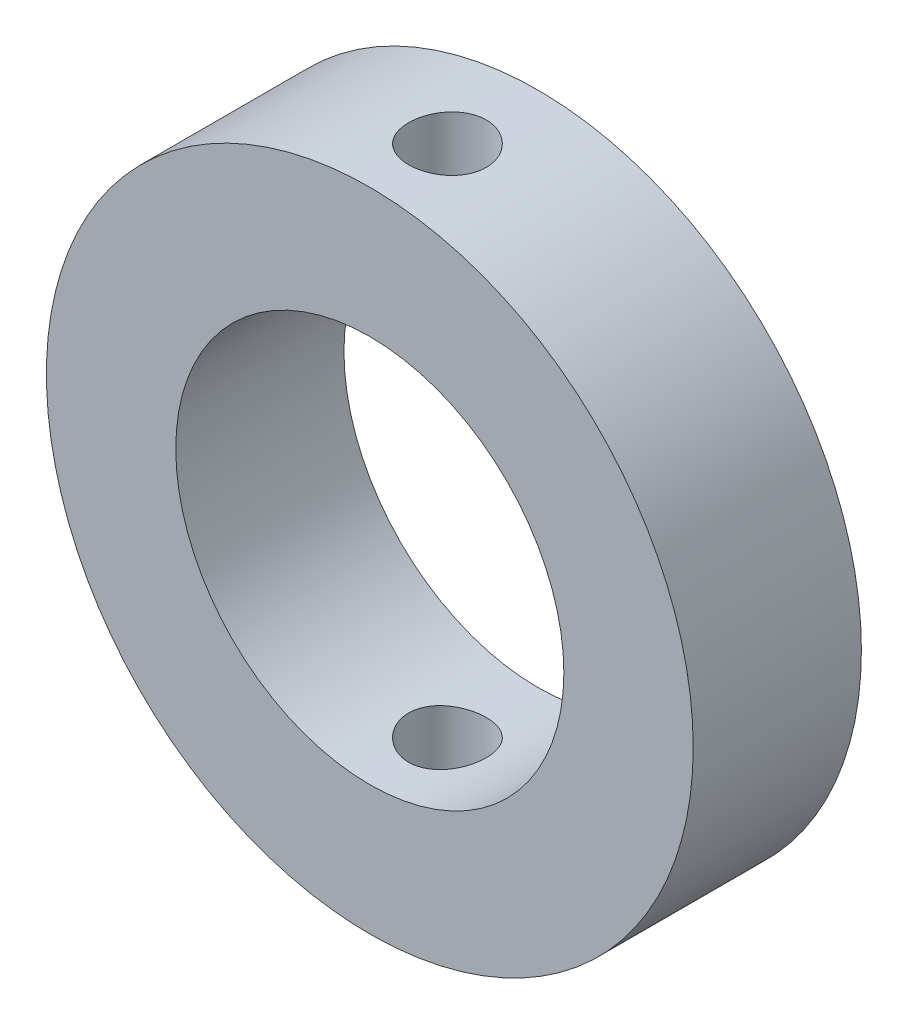
ISO-10303-21;
HEADER;
FILE_DESCRIPTION(('STEP AP214'),'2;1');
FILE_NAME('part.step','',(''),(''),'','','');
FILE_SCHEMA(('AUTOMOTIVE_DESIGN { 1 0 10303 214 1 1 1 1 }'));
ENDSEC;
DATA;
#1=APPLICATION_CONTEXT('core data for automotive mechanical design processes');
#2=APPLICATION_PROTOCOL_DEFINITION('international standard','automotive_design',2000,#1);
#3=PRODUCT_CONTEXT('',#1,'mechanical');
#4=PRODUCT('Part','Part','',(#3));
#5=PRODUCT_RELATED_PRODUCT_CATEGORY('part','',(#4));
#6=PRODUCT_DEFINITION_FORMATION('','',#4);
#7=PRODUCT_DEFINITION_CONTEXT('part definition',#1,'design');
#8=PRODUCT_DEFINITION('design','',#6,#7);
#9=PRODUCT_DEFINITION_SHAPE('','',#8);
#10=(LENGTH_UNIT() NAMED_UNIT(*) SI_UNIT(.MILLI.,.METRE.));
#11=(NAMED_UNIT(*) PLANE_ANGLE_UNIT() SI_UNIT($,.RADIAN.));
#12=(NAMED_UNIT(*) SI_UNIT($,.STERADIAN.) SOLID_ANGLE_UNIT());
#13=UNCERTAINTY_MEASURE_WITH_UNIT(LENGTH_MEASURE(1.E-05),#10,'distance_accuracy_value','');
#14=(GEOMETRIC_REPRESENTATION_CONTEXT(3) GLOBAL_UNCERTAINTY_ASSIGNED_CONTEXT((#13)) GLOBAL_UNIT_ASSIGNED_CONTEXT((#10,
#11,#12)) REPRESENTATION_CONTEXT('',''));
#15=CARTESIAN_POINT('',(0.,0.,0.));
#16=DIRECTION('',(0.,0.,1.));
#17=DIRECTION('',(1.,0.,0.));
#18=AXIS2_PLACEMENT_3D('',#15,#16,#17);
#19=CARTESIAN_POINT('',(0.,0.,13.));
#20=DIRECTION('',(0.,0.,1.));
#21=DIRECTION('',(1.,0.,0.));
#22=AXIS2_PLACEMENT_3D('',#19,#20,#21);
#23=PLANE('',#22);
#24=CARTESIAN_POINT('',(0.,0.,13.));
#25=DIRECTION('',(0.,0.,1.));
#26=DIRECTION('',(1.,0.,0.));
#27=AXIS2_PLACEMENT_3D('',#24,#25,#26);
#28=CIRCLE('',#27,25.);
#29=CARTESIAN_POINT('',(25.,0.,13.));
#30=VERTEX_POINT('',#29);
#31=EDGE_CURVE('E10',#30,#30,#28,.T.);
#32=ORIENTED_EDGE('',*,*,#31,.T.);
#33=EDGE_LOOP('',(#32));
#34=FACE_BOUND('',#33,.T.);
#35=CARTESIAN_POINT('',(0.,0.,13.));
#36=DIRECTION('',(0.,0.,1.));
#37=DIRECTION('',(1.,0.,0.));
#38=AXIS2_PLACEMENT_3D('',#35,#36,#37);
#39=CIRCLE('',#38,15.);
#40=CARTESIAN_POINT('',(15.,0.,13.));
#41=VERTEX_POINT('',#40);
#42=EDGE_CURVE('E58',#41,#41,#39,.T.);
#43=ORIENTED_EDGE('',*,*,#42,.F.);
#44=EDGE_LOOP('',(#43));
#45=FACE_BOUND('',#44,.T.);
#46=ADVANCED_FACE('F37',(#34,#45),#23,.T.);
#47=CARTESIAN_POINT('',(0.,0.,0.));
#48=DIRECTION('',(0.,0.,1.));
#49=DIRECTION('',(1.,0.,0.));
#50=AXIS2_PLACEMENT_3D('',#47,#48,#49);
#51=PLANE('',#50);
#52=CARTESIAN_POINT('',(0.,0.,0.));
#53=DIRECTION('',(0.,0.,1.));
#54=DIRECTION('',(1.,0.,0.));
#55=AXIS2_PLACEMENT_3D('',#52,#53,#54);
#56=CIRCLE('',#55,25.);
#57=CARTESIAN_POINT('',(25.,0.,0.));
#58=VERTEX_POINT('',#57);
#59=EDGE_CURVE('E52',#58,#58,#56,.T.);
#60=ORIENTED_EDGE('',*,*,#59,.F.);
#61=EDGE_LOOP('',(#60));
#62=FACE_BOUND('',#61,.T.);
#63=CARTESIAN_POINT('',(0.,0.,0.));
#64=DIRECTION('',(0.,0.,1.));
#65=DIRECTION('',(1.,0.,0.));
#66=AXIS2_PLACEMENT_3D('',#63,#64,#65);
#67=CIRCLE('',#66,15.);
#68=CARTESIAN_POINT('',(15.,0.,0.));
#69=VERTEX_POINT('',#68);
#70=EDGE_CURVE('E61',#69,#69,#67,.T.);
#71=ORIENTED_EDGE('',*,*,#70,.T.);
#72=EDGE_LOOP('',(#71));
#73=FACE_BOUND('',#72,.T.);
#74=ADVANCED_FACE('F102',(#62,#73),#51,.F.);
#75=CARTESIAN_POINT('',(0.,0.,13.));
#76=DIRECTION('',(0.,0.,-1.));
#77=DIRECTION('',(-1.,0.,0.));
#78=AXIS2_PLACEMENT_3D('',#75,#76,#77);
#79=CYLINDRICAL_SURFACE('',#78,25.);
#80=CARTESIAN_POINT('',(0.,-25.,10.));
#81=CARTESIAN_POINT('',(0.167864047107699,-24.9999977357459,9.99999283605856));
#82=CARTESIAN_POINT('',(0.335834317331191,-24.9982914200408,9.98586334130731));
#83=CARTESIAN_POINT('',(0.667104571308249,-24.991648705422,9.92971893584461));
#84=CARTESIAN_POINT('',(0.830399429590069,-24.9867088933728,9.88767455874941));
#85=CARTESIAN_POINT('',(1.14747479534053,-24.9741559265426,9.77695372347398));
#86=CARTESIAN_POINT('',(1.30126148759225,-24.9665445315309,9.70829479317582));
#87=CARTESIAN_POINT('',(1.595099157832,-24.9494959264345,9.5463312649167));
#88=CARTESIAN_POINT('',(1.73515256713516,-24.9400590404141,9.45303104024668));
#89=CARTESIAN_POINT('',(1.99829131534451,-24.920360105442,9.24392513802476));
#90=CARTESIAN_POINT('',(2.1212966913072,-24.9100945030904,9.12801915988808));
#91=CARTESIAN_POINT('',(2.34615931038342,-24.8899239397152,8.8772070351121));
#92=CARTESIAN_POINT('',(2.44801549826474,-24.8800189967068,8.74229994098135));
#93=CARTESIAN_POINT('',(2.62798342873896,-24.8616560370405,8.45679917470161));
#94=CARTESIAN_POINT('',(2.7060207567257,-24.8532025903971,8.30615827541986));
#95=CARTESIAN_POINT('',(2.8356605730156,-24.8387461344686,7.99379129789125));
#96=CARTESIAN_POINT('',(2.88726398696776,-24.8327430393798,7.83206560803069));
#97=CARTESIAN_POINT('',(2.96232930045399,-24.8239006073737,7.50294714068857));
#98=CARTESIAN_POINT('',(2.98592577987646,-24.8210461452543,7.33558547157232));
#99=CARTESIAN_POINT('',(3.0047237521967,-24.8187777690611,6.99925506363583));
#100=CARTESIAN_POINT('',(2.99992630052848,-24.8193637271033,6.83028638478303));
#101=CARTESIAN_POINT('',(2.96218316078668,-24.8238961466306,6.49647403521565));
#102=CARTESIAN_POINT('',(2.92938543222303,-24.8278249434675,6.33161336131982));
#103=CARTESIAN_POINT('',(2.83680346170067,-24.8385728087608,6.00975297217864));
#104=CARTESIAN_POINT('',(2.77701871225814,-24.8453919315688,5.852753404821));
#105=CARTESIAN_POINT('',(2.63199980699862,-24.8611722079476,5.55061053176088));
#106=CARTESIAN_POINT('',(2.54670106203925,-24.8701387862198,5.40549852164644));
#107=CARTESIAN_POINT('',(2.35312173169469,-24.8891993987901,5.13159278908423));
#108=CARTESIAN_POINT('',(2.24484017723156,-24.8992934806213,5.00279975509742));
#109=CARTESIAN_POINT('',(2.0075475556218,-24.9195503308637,4.76432891563562));
#110=CARTESIAN_POINT('',(1.87840890051216,-24.929713127424,4.65477803014294));
#111=CARTESIAN_POINT('',(1.60350795893872,-24.9489020798549,4.45888847899969));
#112=CARTESIAN_POINT('',(1.45774563908004,-24.9579282334421,4.37254985998085));
#113=CARTESIAN_POINT('',(1.15363930826284,-24.9738318861702,4.22553671436034));
#114=CARTESIAN_POINT('',(0.99529157871559,-24.9807087472809,4.16486980666956));
#115=CARTESIAN_POINT('',(0.670556022273439,-24.991533065309,4.0710212621491));
#116=CARTESIAN_POINT('',(0.504168542441622,-24.9954806485584,4.03783843999552));
#117=CARTESIAN_POINT('',(0.169174396374216,-24.9999852500304,4.00006374450231));
#118=CARTESIAN_POINT('',(0.00058772043205139,-25.0005630093753,3.9952969675993));
#119=CARTESIAN_POINT('',(-0.33498206824326,-24.9983187823231,4.01402857786827));
#120=CARTESIAN_POINT('',(-0.501965212327329,-24.9954968625308,4.03752641129535));
#121=CARTESIAN_POINT('',(-0.829074263928357,-24.9867833380686,4.11197496400309));
#122=CARTESIAN_POINT('',(-0.989219346369035,-24.9809010237909,4.16284261305008));
#123=CARTESIAN_POINT('',(-1.29870539768646,-24.9667255501792,4.29050070335358));
#124=CARTESIAN_POINT('',(-1.44804602592347,-24.9584323148759,4.36729196149008));
#125=CARTESIAN_POINT('',(-1.73246717766504,-24.9403085158695,4.54504291590243));
#126=CARTESIAN_POINT('',(-1.86747628962751,-24.9304708084643,4.64611613781082));
#127=CARTESIAN_POINT('',(-2.11867625152203,-24.9103817919419,4.86940084640817));
#128=CARTESIAN_POINT('',(-2.23486641472949,-24.9001304677484,4.99161310414795));
#129=CARTESIAN_POINT('',(-2.44574795226154,-24.8803059484942,5.25447561542769));
#130=CARTESIAN_POINT('',(-2.54032363231939,-24.8707365831307,5.39521901534385));
#131=CARTESIAN_POINT('',(-2.70449314429332,-24.8534214993383,5.69069502507556));
#132=CARTESIAN_POINT('',(-2.77408744356074,-24.8456757467943,5.84542737311824));
#133=CARTESIAN_POINT('',(-2.88612996668159,-24.8329105734502,6.16411060889469));
#134=CARTESIAN_POINT('',(-2.92864420159346,-24.8278845275633,6.32803801185939));
#135=CARTESIAN_POINT('',(-2.98553272163516,-24.8211085274587,6.66076896948507));
#136=CARTESIAN_POINT('',(-2.99990820526081,-24.8193584337106,6.82957231615732));
#137=CARTESIAN_POINT('',(-3.00009033817931,-24.819336326607,7.16611272963717));
#138=CARTESIAN_POINT('',(-2.98607873671351,-24.8210421863943,7.33384972577127));
#139=CARTESIAN_POINT('',(-2.93026848672089,-24.8276922947425,7.66456678639417));
#140=CARTESIAN_POINT('',(-2.88846982822067,-24.8326365444656,7.82754684917558));
#141=CARTESIAN_POINT('',(-2.77832739820545,-24.8451996524586,8.1441045388887));
#142=CARTESIAN_POINT('',(-2.70999165570539,-24.8528177016812,8.29768499349548));
#143=CARTESIAN_POINT('',(-2.54873282628009,-24.8698714539139,8.5912277470701));
#144=CARTESIAN_POINT('',(-2.45580952709445,-24.8793071726153,8.7311899284593));
#145=CARTESIAN_POINT('',(-2.24733689647205,-24.8990055122588,8.99445294010884));
#146=CARTESIAN_POINT('',(-2.1316520393015,-24.9092728581347,9.11764610326628));
#147=CARTESIAN_POINT('',(-1.88122093334447,-24.9294354968169,9.342942479566));
#148=CARTESIAN_POINT('',(-1.74647018263601,-24.939330701051,9.44504069762919));
#149=CARTESIAN_POINT('',(-1.46119322465137,-24.9576721709324,9.62555057799885));
#150=CARTESIAN_POINT('',(-1.31061323462417,-24.966113221621,9.70387772572228));
#151=CARTESIAN_POINT('',(-0.998422751685311,-24.9805418519727,9.83402376444257));
#152=CARTESIAN_POINT('',(-0.836824564362144,-24.9865321180615,9.88587169618039));
#153=CARTESIAN_POINT('',(-0.561977101236695,-24.9939268325999,9.94906342033812));
#154=CARTESIAN_POINT('',(-0.450466569753485,-24.996193279433,9.96813748388637));
#155=CARTESIAN_POINT('',(-0.225986735693693,-24.9992306204204,9.99360814349096));
#156=CARTESIAN_POINT('',(-0.113017442753625,-25.0000015244492,10.0000048232504));
#157=CARTESIAN_POINT('',(0.,-25.,10.));
#158=B_SPLINE_CURVE_WITH_KNOTS('',3,(#80,#81,#82,#83,#84,#85,#86,#87,#88,#89,#90,#91,#92,#93,
#94,#95,#96,#97,#98,#99,#100,#101,#102,#103,#104,#105,#106,#107,#108,#109,#110,#111,#112,#113,
#114,#115,#116,#117,#118,#119,#120,#121,#122,#123,#124,#125,#126,#127,#128,#129,#130,#131,#132,
#133,#134,#135,#136,#137,#138,#139,#140,#141,#142,#143,#144,#145,#146,#147,#148,#149,#150,#151,
#152,#153,#154,#155,#156,#157),.UNSPECIFIED.,.T.,.F.,(4,2,2,2,2,2,2,2,2,2,2,2,2,2,2,2,2,2,2,2,2,
2,2,2,2,2,2,2,2,2,2,2,2,2,2,2,2,2,4),(0.,0.503179350956159,1.00689069408623,1.5102708637556,
2.01356175441693,2.51913872195878,3.02474090904883,3.53190689496397,4.03905511999114,
4.54375638343279,5.0484388866848,5.55047092912253,6.05251241253396,6.55583573710536,
7.05918028869262,7.56572944640317,8.07227962172601,8.57898002694278,9.08565857822619,
9.58921522624226,10.0927620090108,10.5947890255775,11.0968318630167,11.6012692178556,
12.1057249760357,12.6128207581672,13.119907053063,13.6257524826489,14.1315763666154,
14.6341719319229,15.1367676776234,15.6392114771388,16.1416596143122,16.6471952402032,
17.1528504352009,17.6602829023946,18.1671576479275,18.5059342945627,18.8447087043981),.UNSPECIFIED.);
#159=CARTESIAN_POINT('',(0.,-25.,10.));
#160=VERTEX_POINT('',#159);
#161=EDGE_CURVE('E88',#160,#160,#158,.T.);
#162=ORIENTED_EDGE('',*,*,#161,.T.);
#163=EDGE_LOOP('',(#162));
#164=FACE_BOUND('',#163,.T.);
#165=CARTESIAN_POINT('',(0.,25.,10.));
#166=CARTESIAN_POINT('',(-0.167864047107699,24.9999977357459,9.99999283605856));
#167=CARTESIAN_POINT('',(-0.335834317331191,24.9982914200408,9.98586334130731));
#168=CARTESIAN_POINT('',(-0.66710457130825,24.991648705422,9.92971893584461));
#169=CARTESIAN_POINT('',(-0.830399429590069,24.9867088933728,9.88767455874941));
#170=CARTESIAN_POINT('',(-1.14747479534053,24.9741559265426,9.77695372347398));
#171=CARTESIAN_POINT('',(-1.30126148759225,24.9665445315309,9.70829479317582));
#172=CARTESIAN_POINT('',(-1.595099157832,24.9494959264345,9.5463312649167));
#173=CARTESIAN_POINT('',(-1.73515256713516,24.9400590404141,9.45303104024668));
#174=CARTESIAN_POINT('',(-1.99829131534451,24.920360105442,9.24392513802476));
#175=CARTESIAN_POINT('',(-2.1212966913072,24.9100945030904,9.12801915988808));
#176=CARTESIAN_POINT('',(-2.34615931038342,24.8899239397152,8.8772070351121));
#177=CARTESIAN_POINT('',(-2.44801549826474,24.8800189967068,8.74229994098135));
#178=CARTESIAN_POINT('',(-2.62798342873896,24.8616560370405,8.45679917470161));
#179=CARTESIAN_POINT('',(-2.7060207567257,24.8532025903971,8.30615827541986));
#180=CARTESIAN_POINT('',(-2.8356605730156,24.8387461344686,7.99379129789125));
#181=CARTESIAN_POINT('',(-2.88726398696776,24.8327430393798,7.83206560803069));
#182=CARTESIAN_POINT('',(-2.96232930045399,24.8239006073737,7.50294714068857));
#183=CARTESIAN_POINT('',(-2.98592577987646,24.8210461452543,7.33558547157232));
#184=CARTESIAN_POINT('',(-3.0047237521967,24.8187777690611,6.99925506363583));
#185=CARTESIAN_POINT('',(-2.99992630052848,24.8193637271033,6.83028638478303));
#186=CARTESIAN_POINT('',(-2.96218316078668,24.8238961466306,6.49647403521565));
#187=CARTESIAN_POINT('',(-2.92938543222303,24.8278249434675,6.33161336131982));
#188=CARTESIAN_POINT('',(-2.83680346170067,24.8385728087608,6.00975297217864));
#189=CARTESIAN_POINT('',(-2.77701871225814,24.8453919315688,5.852753404821));
#190=CARTESIAN_POINT('',(-2.63199980699862,24.8611722079476,5.55061053176088));
#191=CARTESIAN_POINT('',(-2.54670106203925,24.8701387862198,5.40549852164644));
#192=CARTESIAN_POINT('',(-2.35312173169469,24.8891993987901,5.13159278908423));
#193=CARTESIAN_POINT('',(-2.24484017723157,24.8992934806213,5.00279975509742));
#194=CARTESIAN_POINT('',(-2.0075475556218,24.9195503308637,4.76432891563562));
#195=CARTESIAN_POINT('',(-1.87840890051216,24.929713127424,4.65477803014294));
#196=CARTESIAN_POINT('',(-1.60350795893872,24.9489020798549,4.45888847899969));
#197=CARTESIAN_POINT('',(-1.45774563908005,24.9579282334421,4.37254985998085));
#198=CARTESIAN_POINT('',(-1.15363930826285,24.9738318861702,4.22553671436034));
#199=CARTESIAN_POINT('',(-0.995291578715592,24.9807087472809,4.16486980666956));
#200=CARTESIAN_POINT('',(-0.67055602227344,24.991533065309,4.0710212621491));
#201=CARTESIAN_POINT('',(-0.504168542441624,24.9954806485584,4.03783843999552));
#202=CARTESIAN_POINT('',(-0.169174396374217,24.9999852500304,4.00006374450231));
#203=CARTESIAN_POINT('',(-0.000587720432052122,25.0005630093753,3.9952969675993));
#204=CARTESIAN_POINT('',(0.33498206824326,24.9983187823231,4.01402857786827));
#205=CARTESIAN_POINT('',(0.501965212327329,24.9954968625308,4.03752641129535));
#206=CARTESIAN_POINT('',(0.829074263928357,24.9867833380686,4.11197496400309));
#207=CARTESIAN_POINT('',(0.989219346369036,24.9809010237909,4.16284261305008));
#208=CARTESIAN_POINT('',(1.29870539768646,24.9667255501792,4.29050070335358));
#209=CARTESIAN_POINT('',(1.44804602592347,24.9584323148759,4.36729196149009));
#210=CARTESIAN_POINT('',(1.73246717766505,24.9403085158695,4.54504291590243));
#211=CARTESIAN_POINT('',(1.86747628962751,24.9304708084643,4.64611613781082));
#212=CARTESIAN_POINT('',(2.11867625152204,24.9103817919419,4.86940084640817));
#213=CARTESIAN_POINT('',(2.23486641472949,24.9001304677484,4.99161310414795));
#214=CARTESIAN_POINT('',(2.44574795226154,24.8803059484942,5.25447561542769));
#215=CARTESIAN_POINT('',(2.54032363231939,24.8707365831307,5.39521901534385));
#216=CARTESIAN_POINT('',(2.70449314429332,24.8534214993383,5.69069502507556));
#217=CARTESIAN_POINT('',(2.77408744356074,24.8456757467943,5.84542737311824));
#218=CARTESIAN_POINT('',(2.88612996668159,24.8329105734502,6.16411060889469));
#219=CARTESIAN_POINT('',(2.92864420159346,24.8278845275633,6.32803801185939));
#220=CARTESIAN_POINT('',(2.98553272163516,24.8211085274587,6.66076896948507));
#221=CARTESIAN_POINT('',(2.99990820526081,24.8193584337106,6.82957231615732));
#222=CARTESIAN_POINT('',(3.00009033817931,24.819336326607,7.16611272963717));
#223=CARTESIAN_POINT('',(2.98607873671351,24.8210421863943,7.33384972577126));
#224=CARTESIAN_POINT('',(2.93026848672089,24.8276922947425,7.66456678639417));
#225=CARTESIAN_POINT('',(2.88846982822067,24.8326365444656,7.82754684917558));
#226=CARTESIAN_POINT('',(2.77832739820545,24.8451996524586,8.14410453888869));
#227=CARTESIAN_POINT('',(2.70999165570539,24.8528177016812,8.29768499349548));
#228=CARTESIAN_POINT('',(2.5487328262801,24.8698714539139,8.5912277470701));
#229=CARTESIAN_POINT('',(2.45580952709445,24.8793071726153,8.7311899284593));
#230=CARTESIAN_POINT('',(2.24733689647205,24.8990055122588,8.99445294010883));
#231=CARTESIAN_POINT('',(2.1316520393015,24.9092728581347,9.11764610326627));
#232=CARTESIAN_POINT('',(1.88122093334448,24.9294354968169,9.342942479566));
#233=CARTESIAN_POINT('',(1.74647018263601,24.939330701051,9.44504069762919));
#234=CARTESIAN_POINT('',(1.46119322465137,24.9576721709324,9.62555057799885));
#235=CARTESIAN_POINT('',(1.31061323462418,24.966113221621,9.70387772572228));
#236=CARTESIAN_POINT('',(0.998422751685312,24.9805418519727,9.83402376444257));
#237=CARTESIAN_POINT('',(0.836824564362145,24.9865321180615,9.88587169618038));
#238=CARTESIAN_POINT('',(0.561977101236698,24.9939268325999,9.94906342033812));
#239=CARTESIAN_POINT('',(0.450466569753488,24.996193279433,9.96813748388637));
#240=CARTESIAN_POINT('',(0.225986735693695,24.9992306204204,9.99360814349096));
#241=CARTESIAN_POINT('',(0.113017442753626,25.0000015244492,10.0000048232504));
#242=CARTESIAN_POINT('',(0.,25.,10.));
#243=B_SPLINE_CURVE_WITH_KNOTS('',3,(#165,#166,#167,#168,#169,#170,#171,#172,#173,#174,#175,
#176,#177,#178,#179,#180,#181,#182,#183,#184,#185,#186,#187,#188,#189,#190,#191,#192,#193,#194,
#195,#196,#197,#198,#199,#200,#201,#202,#203,#204,#205,#206,#207,#208,#209,#210,#211,#212,#213,
#214,#215,#216,#217,#218,#219,#220,#221,#222,#223,#224,#225,#226,#227,#228,#229,#230,#231,#232,
#233,#234,#235,#236,#237,#238,#239,#240,#241,#242),.UNSPECIFIED.,.T.,.F.,(4,2,2,2,2,2,2,2,2,2,2,
2,2,2,2,2,2,2,2,2,2,2,2,2,2,2,2,2,2,2,2,2,2,2,2,2,2,2,4),(0.,0.503179350956159,1.00689069408623,
1.5102708637556,2.01356175441693,2.51913872195878,3.02474090904884,3.53190689496398,
4.03905511999114,4.54375638343279,5.0484388866848,5.55047092912253,6.05251241253396,
6.55583573710536,7.05918028869262,7.56572944640317,8.07227962172601,8.57898002694278,
9.08565857822619,9.58921522624226,10.0927620090108,10.5947890255775,11.0968318630167,
11.6012692178556,12.1057249760357,12.6128207581672,13.119907053063,13.6257524826489,
14.1315763666154,14.6341719319229,15.1367676776234,15.6392114771388,16.1416596143121,
16.6471952402032,17.1528504352009,17.6602829023946,18.1671576479275,18.5059342945627,
18.8447087043981),.UNSPECIFIED.);
#244=CARTESIAN_POINT('',(0.,25.,10.));
#245=VERTEX_POINT('',#244);
#246=EDGE_CURVE('E82',#245,#245,#243,.T.);
#247=ORIENTED_EDGE('',*,*,#246,.T.);
#248=EDGE_LOOP('',(#247));
#249=FACE_BOUND('',#248,.T.);
#250=ORIENTED_EDGE('',*,*,#31,.F.);
#251=EDGE_LOOP('',(#250));
#252=FACE_BOUND('',#251,.T.);
#253=ORIENTED_EDGE('',*,*,#59,.T.);
#254=EDGE_LOOP('',(#253));
#255=FACE_BOUND('',#254,.T.);
#256=ADVANCED_FACE('F39',(#164,#249,#252,#255),#79,.T.);
#257=CARTESIAN_POINT('',(0.,0.,13.));
#258=DIRECTION('',(0.,0.,-1.));
#259=DIRECTION('',(-1.,0.,0.));
#260=AXIS2_PLACEMENT_3D('',#257,#258,#259);
#261=CYLINDRICAL_SURFACE('',#260,15.);
#262=CARTESIAN_POINT('',(0.,-15.,10.));
#263=CARTESIAN_POINT('',(0.1667307203779,-14.9999969274261,9.99999386650496));
#264=CARTESIAN_POINT('',(0.333538980604567,-14.9971915553469,9.98605347109706));
#265=CARTESIAN_POINT('',(0.662440523067058,-14.9862709686969,9.93070449965426));
#266=CARTESIAN_POINT('',(0.824529952624067,-14.9781515358056,9.88927410159547));
#267=CARTESIAN_POINT('',(1.13919091578994,-14.9575094783486,9.78027617913763));
#268=CARTESIAN_POINT('',(1.2917714037994,-14.9449910723015,9.71273368946593));
#269=CARTESIAN_POINT('',(1.58342396659268,-14.9169119410594,9.55350325746611));
#270=CARTESIAN_POINT('',(1.72249684522744,-14.9013513970712,9.46181675317838));
#271=CARTESIAN_POINT('',(1.9850804319446,-14.8686649598991,9.25558451712569));
#272=CARTESIAN_POINT('',(2.10838185347557,-14.8515223651304,9.14077493382639));
#273=CARTESIAN_POINT('',(2.33411026982408,-14.8177254135776,8.89212275082489));
#274=CARTESIAN_POINT('',(2.43653563431127,-14.8010710950127,8.75827866599464));
#275=CARTESIAN_POINT('',(2.61849526004286,-14.7699732543785,8.47385142096437));
#276=CARTESIAN_POINT('',(2.6978128165976,-14.7555512209484,8.32312706861092));
#277=CARTESIAN_POINT('',(2.82991699974092,-14.7307880417525,8.01015454298776));
#278=CARTESIAN_POINT('',(2.88270624731171,-14.7204464928588,7.84790750996096));
#279=CARTESIAN_POINT('',(2.95957589965448,-14.7051841575661,7.51874690827625));
#280=CARTESIAN_POINT('',(2.98402349387633,-14.7001941032156,7.35192236757332));
#281=CARTESIAN_POINT('',(3.00465638317836,-14.6959912518188,7.01647053590697));
#282=CARTESIAN_POINT('',(3.0008445681405,-14.6967778640352,6.84784343103956));
#283=CARTESIAN_POINT('',(2.96536371930546,-14.7039765344455,6.51625963593699));
#284=CARTESIAN_POINT('',(2.93411562073172,-14.7103035857629,6.35325578311806));
#285=CARTESIAN_POINT('',(2.84531365386915,-14.7277363848,6.03485177001099));
#286=CARTESIAN_POINT('',(2.78775852930204,-14.7388423607334,5.87945197324297));
#287=CARTESIAN_POINT('',(2.64757435102416,-14.7646685550122,5.5794542148892));
#288=CARTESIAN_POINT('',(2.56477845369634,-14.7794126944111,5.43493636129248));
#289=CARTESIAN_POINT('',(2.37658072371804,-14.8108385631919,5.16168745008155));
#290=CARTESIAN_POINT('',(2.27117629307049,-14.827520515151,5.03295820944652));
#291=CARTESIAN_POINT('',(2.03849980368175,-14.8613106372439,4.79251179262919));
#292=CARTESIAN_POINT('',(1.91086848363733,-14.8784210763271,4.68114229642261));
#293=CARTESIAN_POINT('',(1.63855507218603,-14.9108654614323,4.48133846109632));
#294=CARTESIAN_POINT('',(1.49387276213817,-14.9261993846692,4.39290441611926));
#295=CARTESIAN_POINT('',(1.19117816063676,-14.9534007048266,4.24141747232207));
#296=CARTESIAN_POINT('',(1.0331454587559,-14.9652626654482,4.17840431906639));
#297=CARTESIAN_POINT('',(0.708446929345993,-14.9841422696357,4.0799185778843));
#298=CARTESIAN_POINT('',(0.541782150217347,-14.9911605000159,4.04444265377911));
#299=CARTESIAN_POINT('',(0.207538216881449,-14.999480156006,4.00253063861717));
#300=CARTESIAN_POINT('',(0.0400209849767262,-15.0008752395741,3.99561874137919));
#301=CARTESIAN_POINT('',(-0.293774802578144,-14.9980515579031,4.00974957682654));
#302=CARTESIAN_POINT('',(-0.460053427331381,-14.9938331082434,4.03079073805779));
#303=CARTESIAN_POINT('',(-0.785116979839624,-14.9803149602405,4.09983512063187));
#304=CARTESIAN_POINT('',(-0.943955845019711,-14.9710612921262,4.14759420549371));
#305=CARTESIAN_POINT('',(-1.251370882499,-14.948506561831,4.26845194796743));
#306=CARTESIAN_POINT('',(-1.39994628491262,-14.9352051964268,4.34155250403049));
#307=CARTESIAN_POINT('',(-1.68462352105865,-14.9057973459988,4.51204747195394));
#308=CARTESIAN_POINT('',(-1.82055038025656,-14.8896585131116,4.60972834311683));
#309=CARTESIAN_POINT('',(-2.07425405735762,-14.8564420448965,4.82622757362184));
#310=CARTESIAN_POINT('',(-2.19202892679229,-14.8393643090516,4.9450481991996));
#311=CARTESIAN_POINT('',(-2.40792177232253,-14.8058791067089,5.20262005567337));
#312=CARTESIAN_POINT('',(-2.50571310734597,-14.7894858069991,5.34164723266401));
#313=CARTESIAN_POINT('',(-2.67655626015362,-14.7595257538858,5.63443408407004));
#314=CARTESIAN_POINT('',(-2.74960906776871,-14.7459588874003,5.78819316872066));
#315=CARTESIAN_POINT('',(-2.86845552474588,-14.7233022175315,6.10530473844864));
#316=CARTESIAN_POINT('',(-2.91439049937315,-14.7141892461656,6.26860252363096));
#317=CARTESIAN_POINT('',(-2.97812595488159,-14.7014231037608,6.60080036047271));
#318=CARTESIAN_POINT('',(-2.99593010467534,-14.6977692207333,6.76969967862804));
#319=CARTESIAN_POINT('',(-3.0027627326024,-14.6963744889414,7.10502659363296));
#320=CARTESIAN_POINT('',(-2.99230736421269,-14.698527575679,7.27144344678103));
#321=CARTESIAN_POINT('',(-2.94405691230018,-14.7082672045384,7.60009494971508));
#322=CARTESIAN_POINT('',(-2.90626204838789,-14.7158537030151,7.76232963308442));
#323=CARTESIAN_POINT('',(-2.80463570549686,-14.7355579265748,8.07768313372164));
#324=CARTESIAN_POINT('',(-2.74086752015203,-14.7476646305649,8.23082308150725));
#325=CARTESIAN_POINT('',(-2.58916393380481,-14.7750514492251,8.52431116220332));
#326=CARTESIAN_POINT('',(-2.50122650632465,-14.7903318299668,8.66465822117541));
#327=CARTESIAN_POINT('',(-2.30191774435924,-14.8226688156968,8.93114671645094));
#328=CARTESIAN_POINT('',(-2.19017366170554,-14.839751187291,9.05700629580278));
#329=CARTESIAN_POINT('',(-1.94719310703942,-14.8735824561586,9.28835861658751));
#330=CARTESIAN_POINT('',(-1.81595216146,-14.8903312758955,9.39384667095181));
#331=CARTESIAN_POINT('',(-1.53605288726474,-14.9218149716391,9.58250393183934));
#332=CARTESIAN_POINT('',(-1.3872266532895,-14.9365269365774,9.66542800984008));
#333=CARTESIAN_POINT('',(-1.0774990828222,-14.96205375255,9.80495836778977));
#334=CARTESIAN_POINT('',(-0.916608782589376,-14.9728721141585,9.86158836859748));
#335=CARTESIAN_POINT('',(-0.629464466771336,-14.9872911778611,9.93595584413415));
#336=CARTESIAN_POINT('',(-0.504844992041352,-14.9920290947536,9.95992958112327));
#337=CARTESIAN_POINT('',(-0.2534985756302,-14.9983846241968,9.99195373707509));
#338=CARTESIAN_POINT('',(-0.126771701245857,-15.0000023361946,10.0000046635293));
#339=CARTESIAN_POINT('',(0.,-15.,10.));
#340=B_SPLINE_CURVE_WITH_KNOTS('',3,(#262,#263,#264,#265,#266,#267,#268,#269,#270,#271,#272,
#273,#274,#275,#276,#277,#278,#279,#280,#281,#282,#283,#284,#285,#286,#287,#288,#289,#290,#291,
#292,#293,#294,#295,#296,#297,#298,#299,#300,#301,#302,#303,#304,#305,#306,#307,#308,#309,#310,
#311,#312,#313,#314,#315,#316,#317,#318,#319,#320,#321,#322,#323,#324,#325,#326,#327,#328,#329,
#330,#331,#332,#333,#334,#335,#336,#337,#338,#339),.UNSPECIFIED.,.T.,.F.,(4,2,2,2,2,2,2,2,2,2,2,
2,2,2,2,2,2,2,2,2,2,2,2,2,2,2,2,2,2,2,2,2,2,2,2,2,2,2,4),(0.,0.499728391983775,
0.999853952073969,1.49950120575103,1.99911870669259,2.50479801033656,3.0105167902421,
3.52083585017768,4.03110448095592,4.53468555310762,5.03821512843675,5.53415181018835,
6.03011217761189,6.52942470610778,7.02879464249012,7.53714757474052,8.04550702619461,
8.55465824562072,9.06374777094108,9.56432207028796,10.064868229736,10.5609136185217,
11.0569961764807,11.5591519810008,12.0613616503779,12.5712188573768,13.081055661704,
13.5882114309817,14.0953010499124,14.593191677031,15.0910783047783,15.5877588375933,
16.084481027456,16.5896422871743,17.0949196359879,17.6054849002691,18.1155886655256,
18.4955632586968,18.8755257411299),.UNSPECIFIED.);
#341=CARTESIAN_POINT('',(0.,-15.,10.));
#342=VERTEX_POINT('',#341);
#343=EDGE_CURVE('E42',#342,#342,#340,.T.);
#344=ORIENTED_EDGE('',*,*,#343,.F.);
#345=EDGE_LOOP('',(#344));
#346=FACE_BOUND('',#345,.T.);
#347=CARTESIAN_POINT('',(0.,15.,10.));
#348=CARTESIAN_POINT('',(-0.166730720377899,14.9999969274261,9.99999386650496));
#349=CARTESIAN_POINT('',(-0.333538980604567,14.9971915553469,9.98605347109706));
#350=CARTESIAN_POINT('',(-0.662440523067058,14.9862709686969,9.93070449965426));
#351=CARTESIAN_POINT('',(-0.824529952624068,14.9781515358056,9.88927410159547));
#352=CARTESIAN_POINT('',(-1.13919091578994,14.9575094783486,9.78027617913763));
#353=CARTESIAN_POINT('',(-1.2917714037994,14.9449910723015,9.71273368946593));
#354=CARTESIAN_POINT('',(-1.58342396659268,14.9169119410594,9.55350325746611));
#355=CARTESIAN_POINT('',(-1.72249684522744,14.9013513970712,9.46181675317838));
#356=CARTESIAN_POINT('',(-1.9850804319446,14.8686649598991,9.25558451712569));
#357=CARTESIAN_POINT('',(-2.10838185347557,14.8515223651304,9.14077493382639));
#358=CARTESIAN_POINT('',(-2.33411026982409,14.8177254135776,8.89212275082489));
#359=CARTESIAN_POINT('',(-2.43653563431127,14.8010710950127,8.75827866599464));
#360=CARTESIAN_POINT('',(-2.61849526004286,14.7699732543785,8.47385142096437));
#361=CARTESIAN_POINT('',(-2.6978128165976,14.7555512209484,8.32312706861092));
#362=CARTESIAN_POINT('',(-2.82991699974092,14.7307880417525,8.01015454298776));
#363=CARTESIAN_POINT('',(-2.88270624731171,14.7204464928588,7.84790750996096));
#364=CARTESIAN_POINT('',(-2.95957589965448,14.7051841575661,7.51874690827624));
#365=CARTESIAN_POINT('',(-2.98402349387633,14.7001941032156,7.35192236757332));
#366=CARTESIAN_POINT('',(-3.00465638317836,14.6959912518188,7.01647053590697));
#367=CARTESIAN_POINT('',(-3.0008445681405,14.6967778640352,6.84784343103956));
#368=CARTESIAN_POINT('',(-2.96536371930546,14.7039765344455,6.51625963593699));
#369=CARTESIAN_POINT('',(-2.93411562073172,14.7103035857629,6.35325578311806));
#370=CARTESIAN_POINT('',(-2.84531365386915,14.7277363848,6.03485177001099));
#371=CARTESIAN_POINT('',(-2.78775852930204,14.7388423607334,5.87945197324297));
#372=CARTESIAN_POINT('',(-2.64757435102416,14.7646685550122,5.5794542148892));
#373=CARTESIAN_POINT('',(-2.56477845369634,14.7794126944111,5.43493636129248));
#374=CARTESIAN_POINT('',(-2.37658072371804,14.8108385631919,5.16168745008156));
#375=CARTESIAN_POINT('',(-2.27117629307049,14.827520515151,5.03295820944653));
#376=CARTESIAN_POINT('',(-2.03849980368175,14.8613106372439,4.79251179262919));
#377=CARTESIAN_POINT('',(-1.91086848363734,14.8784210763271,4.68114229642261));
#378=CARTESIAN_POINT('',(-1.63855507218603,14.9108654614323,4.48133846109633));
#379=CARTESIAN_POINT('',(-1.49387276213817,14.9261993846692,4.39290441611926));
#380=CARTESIAN_POINT('',(-1.19117816063676,14.9534007048266,4.24141747232207));
#381=CARTESIAN_POINT('',(-1.0331454587559,14.9652626654482,4.17840431906639));
#382=CARTESIAN_POINT('',(-0.708446929345997,14.9841422696357,4.0799185778843));
#383=CARTESIAN_POINT('',(-0.541782150217351,14.9911605000159,4.04444265377911));
#384=CARTESIAN_POINT('',(-0.207538216881453,14.999480156006,4.00253063861717));
#385=CARTESIAN_POINT('',(-0.0400209849767306,15.0008752395741,3.99561874137919));
#386=CARTESIAN_POINT('',(0.29377480257814,14.9980515579031,4.00974957682654));
#387=CARTESIAN_POINT('',(0.460053427331378,14.9938331082434,4.03079073805778));
#388=CARTESIAN_POINT('',(0.785116979839621,14.9803149602405,4.09983512063187));
#389=CARTESIAN_POINT('',(0.943955845019708,14.9710612921262,4.14759420549371));
#390=CARTESIAN_POINT('',(1.251370882499,14.948506561831,4.26845194796743));
#391=CARTESIAN_POINT('',(1.39994628491262,14.9352051964268,4.34155250403049));
#392=CARTESIAN_POINT('',(1.68462352105865,14.9057973459988,4.51204747195394));
#393=CARTESIAN_POINT('',(1.82055038025656,14.8896585131116,4.60972834311683));
#394=CARTESIAN_POINT('',(2.07425405735762,14.8564420448965,4.82622757362184));
#395=CARTESIAN_POINT('',(2.19202892679229,14.8393643090516,4.9450481991996));
#396=CARTESIAN_POINT('',(2.40792177232253,14.8058791067089,5.20262005567337));
#397=CARTESIAN_POINT('',(2.50571310734596,14.7894858069991,5.34164723266401));
#398=CARTESIAN_POINT('',(2.67655626015362,14.7595257538858,5.63443408407003));
#399=CARTESIAN_POINT('',(2.74960906776871,14.7459588874003,5.78819316872065));
#400=CARTESIAN_POINT('',(2.86845552474588,14.7233022175315,6.10530473844864));
#401=CARTESIAN_POINT('',(2.91439049937315,14.7141892461656,6.26860252363095));
#402=CARTESIAN_POINT('',(2.97812595488159,14.7014231037608,6.60080036047271));
#403=CARTESIAN_POINT('',(2.99593010467534,14.6977692207333,6.76969967862804));
#404=CARTESIAN_POINT('',(3.00276273260241,14.6963744889414,7.10502659363295));
#405=CARTESIAN_POINT('',(2.99230736421269,14.698527575679,7.27144344678103));
#406=CARTESIAN_POINT('',(2.94405691230018,14.7082672045384,7.60009494971508));
#407=CARTESIAN_POINT('',(2.90626204838789,14.7158537030151,7.76232963308441));
#408=CARTESIAN_POINT('',(2.80463570549686,14.7355579265748,8.07768313372163));
#409=CARTESIAN_POINT('',(2.74086752015203,14.7476646305649,8.23082308150724));
#410=CARTESIAN_POINT('',(2.58916393380481,14.7750514492251,8.52431116220332));
#411=CARTESIAN_POINT('',(2.50122650632465,14.7903318299668,8.66465822117541));
#412=CARTESIAN_POINT('',(2.30191774435924,14.8226688156968,8.93114671645094));
#413=CARTESIAN_POINT('',(2.19017366170554,14.839751187291,9.05700629580278));
#414=CARTESIAN_POINT('',(1.94719310703942,14.8735824561586,9.28835861658751));
#415=CARTESIAN_POINT('',(1.81595216146001,14.8903312758955,9.39384667095181));
#416=CARTESIAN_POINT('',(1.53605288726474,14.9218149716391,9.58250393183934));
#417=CARTESIAN_POINT('',(1.38722665328951,14.9365269365774,9.66542800984007));
#418=CARTESIAN_POINT('',(1.0774990828222,14.96205375255,9.80495836778977));
#419=CARTESIAN_POINT('',(0.916608782589381,14.9728721141585,9.86158836859747));
#420=CARTESIAN_POINT('',(0.62946446677134,14.9872911778611,9.93595584413414));
#421=CARTESIAN_POINT('',(0.504844992041354,14.9920290947535,9.95992958112327));
#422=CARTESIAN_POINT('',(0.253498575630201,14.9983846241968,9.99195373707509));
#423=CARTESIAN_POINT('',(0.126771701245857,15.0000023361947,10.0000046635293));
#424=CARTESIAN_POINT('',(0.,15.,10.));
#425=B_SPLINE_CURVE_WITH_KNOTS('',3,(#347,#348,#349,#350,#351,#352,#353,#354,#355,#356,#357,
#358,#359,#360,#361,#362,#363,#364,#365,#366,#367,#368,#369,#370,#371,#372,#373,#374,#375,#376,
#377,#378,#379,#380,#381,#382,#383,#384,#385,#386,#387,#388,#389,#390,#391,#392,#393,#394,#395,
#396,#397,#398,#399,#400,#401,#402,#403,#404,#405,#406,#407,#408,#409,#410,#411,#412,#413,#414,
#415,#416,#417,#418,#419,#420,#421,#422,#423,#424),.UNSPECIFIED.,.T.,.F.,(4,2,2,2,2,2,2,2,2,2,2,
2,2,2,2,2,2,2,2,2,2,2,2,2,2,2,2,2,2,2,2,2,2,2,2,2,2,2,4),(0.,0.499728391983775,0.99985395207397,
1.49950120575103,1.99911870669259,2.50479801033656,3.0105167902421,3.52083585017768,
4.03110448095593,4.53468555310762,5.03821512843675,5.53415181018835,6.03011217761189,
6.52942470610777,7.02879464249011,7.53714757474052,8.0455070261946,8.55465824562071,
9.06374777094108,9.56432207028795,10.064868229736,10.5609136185217,11.0569961764807,
11.5591519810008,12.0613616503779,12.5712188573768,13.081055661704,13.5882114309817,
14.0953010499124,14.593191677031,15.0910783047782,15.5877588375933,16.084481027456,
16.5896422871743,17.0949196359879,17.6054849002691,18.1155886655256,18.4955632586968,
18.8755257411299),.UNSPECIFIED.);
#426=CARTESIAN_POINT('',(0.,15.,10.));
#427=VERTEX_POINT('',#426);
#428=EDGE_CURVE('E63',#427,#427,#425,.T.);
#429=ORIENTED_EDGE('',*,*,#428,.F.);
#430=EDGE_LOOP('',(#429));
#431=FACE_BOUND('',#430,.T.);
#432=ORIENTED_EDGE('',*,*,#42,.T.);
#433=EDGE_LOOP('',(#432));
#434=FACE_BOUND('',#433,.T.);
#435=ORIENTED_EDGE('',*,*,#70,.F.);
#436=EDGE_LOOP('',(#435));
#437=FACE_BOUND('',#436,.T.);
#438=ADVANCED_FACE('F69',(#346,#431,#434,#437),#261,.F.);
#439=CARTESIAN_POINT('',(0.,-41.5,7.));
#440=DIRECTION('',(0.,1.,0.));
#441=DIRECTION('',(0.,0.,1.));
#442=AXIS2_PLACEMENT_3D('',#439,#440,#441);
#443=CYLINDRICAL_SURFACE('',#442,3.);
#444=ORIENTED_EDGE('',*,*,#428,.T.);
#445=EDGE_LOOP('',(#444));
#446=FACE_BOUND('',#445,.T.);
#447=ORIENTED_EDGE('',*,*,#246,.F.);
#448=EDGE_LOOP('',(#447));
#449=FACE_BOUND('',#448,.T.);
#450=ADVANCED_FACE('F75',(#446,#449),#443,.F.);
#451=ORIENTED_EDGE('',*,*,#343,.T.);
#452=EDGE_LOOP('',(#451));
#453=FACE_BOUND('',#452,.T.);
#454=ORIENTED_EDGE('',*,*,#161,.F.);
#455=EDGE_LOOP('',(#454));
#456=FACE_BOUND('',#455,.T.);
#457=ADVANCED_FACE('F72',(#453,#456),#443,.F.);
#458=CLOSED_SHELL('',(#46,#74,#256,#438,#450,#457));
#459=MANIFOLD_SOLID_BREP('B2',#458);
#460=ADVANCED_BREP_SHAPE_REPRESENTATION('',(#18,#459),#14);
#461=SHAPE_DEFINITION_REPRESENTATION(#9,#460);
ENDSEC;
END-ISO-10303-21;
